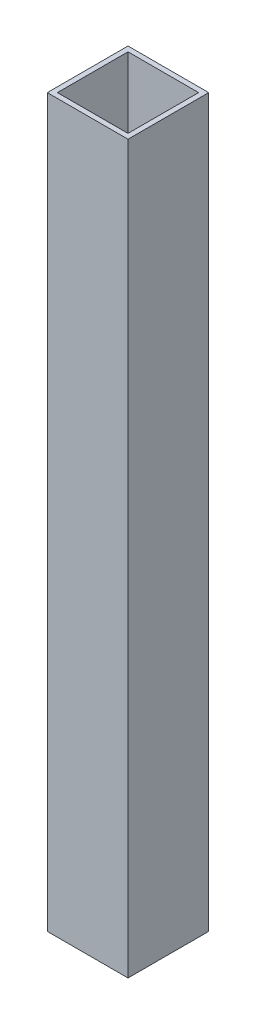
ISO-10303-21;
HEADER;
FILE_DESCRIPTION(('STEP AP214'),'2;1');
FILE_NAME('part.step','',(''),(''),'','','');
FILE_SCHEMA(('AUTOMOTIVE_DESIGN { 1 0 10303 214 1 1 1 1 }'));
ENDSEC;
DATA;
#1=APPLICATION_CONTEXT('core data for automotive mechanical design processes');
#2=APPLICATION_PROTOCOL_DEFINITION('international standard','automotive_design',2000,#1);
#3=PRODUCT_CONTEXT('',#1,'mechanical');
#4=PRODUCT('Part','Part','',(#3));
#5=PRODUCT_RELATED_PRODUCT_CATEGORY('part','',(#4));
#6=PRODUCT_DEFINITION_FORMATION('','',#4);
#7=PRODUCT_DEFINITION_CONTEXT('part definition',#1,'design');
#8=PRODUCT_DEFINITION('design','',#6,#7);
#9=PRODUCT_DEFINITION_SHAPE('','',#8);
#10=(LENGTH_UNIT() NAMED_UNIT(*) SI_UNIT(.MILLI.,.METRE.));
#11=(NAMED_UNIT(*) PLANE_ANGLE_UNIT() SI_UNIT($,.RADIAN.));
#12=(NAMED_UNIT(*) SI_UNIT($,.STERADIAN.) SOLID_ANGLE_UNIT());
#13=UNCERTAINTY_MEASURE_WITH_UNIT(LENGTH_MEASURE(1.E-05),#10,'distance_accuracy_value','');
#14=(GEOMETRIC_REPRESENTATION_CONTEXT(3) GLOBAL_UNCERTAINTY_ASSIGNED_CONTEXT((#13)) GLOBAL_UNIT_ASSIGNED_CONTEXT((#10,
#11,#12)) REPRESENTATION_CONTEXT('',''));
#15=CARTESIAN_POINT('',(0.,0.,0.));
#16=DIRECTION('',(0.,0.,1.));
#17=DIRECTION('',(1.,0.,0.));
#18=AXIS2_PLACEMENT_3D('',#15,#16,#17);
#19=CARTESIAN_POINT('',(0.,228.6,0.));
#20=DIRECTION('',(0.,-1.,0.));
#21=DIRECTION('',(0.,0.,-1.));
#22=AXIS2_PLACEMENT_3D('',#19,#20,#21);
#23=PLANE('',#22);
#24=DIRECTION('',(0.,0.,1.));
#25=VECTOR('',#24,1.);
#26=CARTESIAN_POINT('',(-12.7,228.6,-12.7));
#27=LINE('',#26,#25);
#28=CARTESIAN_POINT('',(-12.7,228.6,-12.7));
#29=VERTEX_POINT('',#28);
#30=CARTESIAN_POINT('',(-12.7,228.6,12.7));
#31=VERTEX_POINT('',#30);
#32=EDGE_CURVE('E134',#29,#31,#27,.T.);
#33=ORIENTED_EDGE('',*,*,#32,.T.);
#34=DIRECTION('',(1.,0.,0.));
#35=VECTOR('',#34,1.);
#36=CARTESIAN_POINT('',(12.7,228.6,12.7));
#37=LINE('',#36,#35);
#38=CARTESIAN_POINT('',(12.7,228.6,12.7));
#39=VERTEX_POINT('',#38);
#40=EDGE_CURVE('E137',#31,#39,#37,.T.);
#41=ORIENTED_EDGE('',*,*,#40,.T.);
#42=DIRECTION('',(0.,0.,-1.));
#43=VECTOR('',#42,1.);
#44=CARTESIAN_POINT('',(12.7,228.6,-12.7));
#45=LINE('',#44,#43);
#46=CARTESIAN_POINT('',(12.7,228.6,-12.7));
#47=VERTEX_POINT('',#46);
#48=EDGE_CURVE('E140',#39,#47,#45,.T.);
#49=ORIENTED_EDGE('',*,*,#48,.T.);
#50=DIRECTION('',(-1.,0.,0.));
#51=VECTOR('',#50,1.);
#52=CARTESIAN_POINT('',(12.7,228.6,-12.7));
#53=LINE('',#52,#51);
#54=EDGE_CURVE('E142',#47,#29,#53,.T.);
#55=ORIENTED_EDGE('',*,*,#54,.T.);
#56=EDGE_LOOP('',(#33,#41,#49,#55));
#57=FACE_BOUND('',#56,.T.);
#58=DIRECTION('',(0.,0.,1.));
#59=VECTOR('',#58,1.);
#60=CARTESIAN_POINT('',(-11.1125,228.6,-11.1125));
#61=LINE('',#60,#59);
#62=CARTESIAN_POINT('',(-11.1125,228.6,-11.1125));
#63=VERTEX_POINT('',#62);
#64=CARTESIAN_POINT('',(-11.1125,228.6,11.1125));
#65=VERTEX_POINT('',#64);
#66=EDGE_CURVE('E98',#63,#65,#61,.T.);
#67=ORIENTED_EDGE('',*,*,#66,.F.);
#68=DIRECTION('',(-1.,0.,0.));
#69=VECTOR('',#68,1.);
#70=CARTESIAN_POINT('',(11.1125,228.6,-11.1125));
#71=LINE('',#70,#69);
#72=CARTESIAN_POINT('',(11.1125,228.6,-11.1125));
#73=VERTEX_POINT('',#72);
#74=EDGE_CURVE('E120',#73,#63,#71,.T.);
#75=ORIENTED_EDGE('',*,*,#74,.F.);
#76=DIRECTION('',(0.,0.,-1.));
#77=VECTOR('',#76,1.);
#78=CARTESIAN_POINT('',(11.1125,228.6,-11.1125));
#79=LINE('',#78,#77);
#80=CARTESIAN_POINT('',(11.1125,228.6,11.1125));
#81=VERTEX_POINT('',#80);
#82=EDGE_CURVE('E118',#81,#73,#79,.T.);
#83=ORIENTED_EDGE('',*,*,#82,.F.);
#84=DIRECTION('',(1.,0.,0.));
#85=VECTOR('',#84,1.);
#86=CARTESIAN_POINT('',(11.1125,228.6,11.1125));
#87=LINE('',#86,#85);
#88=EDGE_CURVE('E106',#65,#81,#87,.T.);
#89=ORIENTED_EDGE('',*,*,#88,.F.);
#90=EDGE_LOOP('',(#67,#75,#83,#89));
#91=FACE_BOUND('',#90,.T.);
#92=ADVANCED_FACE('F33',(#57,#91),#23,.F.);
#93=CARTESIAN_POINT('',(0.,0.,0.));
#94=DIRECTION('',(0.,-1.,0.));
#95=DIRECTION('',(0.,0.,-1.));
#96=AXIS2_PLACEMENT_3D('',#93,#94,#95);
#97=PLANE('',#96);
#98=DIRECTION('',(0.,0.,1.));
#99=VECTOR('',#98,1.);
#100=CARTESIAN_POINT('',(-12.7,0.,-12.7));
#101=LINE('',#100,#99);
#102=CARTESIAN_POINT('',(-12.7,0.,-12.7));
#103=VERTEX_POINT('',#102);
#104=CARTESIAN_POINT('',(-12.7,0.,12.7));
#105=VERTEX_POINT('',#104);
#106=EDGE_CURVE('E114',#103,#105,#101,.T.);
#107=ORIENTED_EDGE('',*,*,#106,.F.);
#108=DIRECTION('',(-1.,0.,0.));
#109=VECTOR('',#108,1.);
#110=CARTESIAN_POINT('',(12.7,0.,-12.7));
#111=LINE('',#110,#109);
#112=CARTESIAN_POINT('',(12.7,0.,-12.7));
#113=VERTEX_POINT('',#112);
#114=EDGE_CURVE('E138',#113,#103,#111,.T.);
#115=ORIENTED_EDGE('',*,*,#114,.F.);
#116=DIRECTION('',(0.,0.,-1.));
#117=VECTOR('',#116,1.);
#118=CARTESIAN_POINT('',(12.7,0.,-12.7));
#119=LINE('',#118,#117);
#120=CARTESIAN_POINT('',(12.7,0.,12.7));
#121=VERTEX_POINT('',#120);
#122=EDGE_CURVE('E149',#121,#113,#119,.T.);
#123=ORIENTED_EDGE('',*,*,#122,.F.);
#124=DIRECTION('',(1.,0.,0.));
#125=VECTOR('',#124,1.);
#126=CARTESIAN_POINT('',(12.7,0.,12.7));
#127=LINE('',#126,#125);
#128=EDGE_CURVE('E147',#105,#121,#127,.T.);
#129=ORIENTED_EDGE('',*,*,#128,.F.);
#130=EDGE_LOOP('',(#107,#115,#123,#129));
#131=FACE_BOUND('',#130,.T.);
#132=DIRECTION('',(-1.,0.,0.));
#133=VECTOR('',#132,1.);
#134=CARTESIAN_POINT('',(11.1125,0.,-11.1125));
#135=LINE('',#134,#133);
#136=CARTESIAN_POINT('',(11.1125,0.,-11.1125));
#137=VERTEX_POINT('',#136);
#138=CARTESIAN_POINT('',(-11.1125,0.,-11.1125));
#139=VERTEX_POINT('',#138);
#140=EDGE_CURVE('E107',#137,#139,#135,.T.);
#141=ORIENTED_EDGE('',*,*,#140,.T.);
#142=DIRECTION('',(0.,0.,1.));
#143=VECTOR('',#142,1.);
#144=CARTESIAN_POINT('',(-11.1125,0.,-11.1125));
#145=LINE('',#144,#143);
#146=CARTESIAN_POINT('',(-11.1125,0.,11.1125));
#147=VERTEX_POINT('',#146);
#148=EDGE_CURVE('E56',#139,#147,#145,.T.);
#149=ORIENTED_EDGE('',*,*,#148,.T.);
#150=DIRECTION('',(1.,0.,0.));
#151=VECTOR('',#150,1.);
#152=CARTESIAN_POINT('',(11.1125,0.,11.1125));
#153=LINE('',#152,#151);
#154=CARTESIAN_POINT('',(11.1125,0.,11.1125));
#155=VERTEX_POINT('',#154);
#156=EDGE_CURVE('E113',#147,#155,#153,.T.);
#157=ORIENTED_EDGE('',*,*,#156,.T.);
#158=DIRECTION('',(0.,0.,-1.));
#159=VECTOR('',#158,1.);
#160=CARTESIAN_POINT('',(11.1125,0.,-11.1125));
#161=LINE('',#160,#159);
#162=EDGE_CURVE('E126',#155,#137,#161,.T.);
#163=ORIENTED_EDGE('',*,*,#162,.T.);
#164=EDGE_LOOP('',(#141,#149,#157,#163));
#165=FACE_BOUND('',#164,.T.);
#166=ADVANCED_FACE('F167',(#131,#165),#97,.T.);
#167=CARTESIAN_POINT('',(-12.7,228.6,-12.7));
#168=DIRECTION('',(1.,0.,0.));
#169=DIRECTION('',(0.,0.,-1.));
#170=AXIS2_PLACEMENT_3D('',#167,#168,#169);
#171=PLANE('',#170);
#172=ORIENTED_EDGE('',*,*,#106,.T.);
#173=DIRECTION('',(0.,-1.,0.));
#174=VECTOR('',#173,1.);
#175=CARTESIAN_POINT('',(-12.7,228.6,12.7));
#176=LINE('',#175,#174);
#177=EDGE_CURVE('E11',#31,#105,#176,.T.);
#178=ORIENTED_EDGE('',*,*,#177,.F.);
#179=ORIENTED_EDGE('',*,*,#32,.F.);
#180=DIRECTION('',(0.,-1.,0.));
#181=VECTOR('',#180,1.);
#182=CARTESIAN_POINT('',(-12.7,228.6,-12.7));
#183=LINE('',#182,#181);
#184=EDGE_CURVE('E144',#29,#103,#183,.T.);
#185=ORIENTED_EDGE('',*,*,#184,.T.);
#186=EDGE_LOOP('',(#172,#178,#179,#185));
#187=FACE_BOUND('',#186,.T.);
#188=ADVANCED_FACE('F35',(#187),#171,.F.);
#189=CARTESIAN_POINT('',(12.7,228.6,12.7));
#190=DIRECTION('',(0.,0.,-1.));
#191=DIRECTION('',(-1.,0.,0.));
#192=AXIS2_PLACEMENT_3D('',#189,#190,#191);
#193=PLANE('',#192);
#194=ORIENTED_EDGE('',*,*,#128,.T.);
#195=DIRECTION('',(0.,-1.,0.));
#196=VECTOR('',#195,1.);
#197=CARTESIAN_POINT('',(12.7,228.6,12.7));
#198=LINE('',#197,#196);
#199=EDGE_CURVE('E41',#39,#121,#198,.T.);
#200=ORIENTED_EDGE('',*,*,#199,.F.);
#201=ORIENTED_EDGE('',*,*,#40,.F.);
#202=ORIENTED_EDGE('',*,*,#177,.T.);
#203=EDGE_LOOP('',(#194,#200,#201,#202));
#204=FACE_BOUND('',#203,.T.);
#205=ADVANCED_FACE('F177',(#204),#193,.F.);
#206=CARTESIAN_POINT('',(12.7,228.6,-12.7));
#207=DIRECTION('',(-1.,0.,0.));
#208=DIRECTION('',(0.,0.,1.));
#209=AXIS2_PLACEMENT_3D('',#206,#207,#208);
#210=PLANE('',#209);
#211=ORIENTED_EDGE('',*,*,#122,.T.);
#212=DIRECTION('',(0.,-1.,0.));
#213=VECTOR('',#212,1.);
#214=CARTESIAN_POINT('',(12.7,228.6,-12.7));
#215=LINE('',#214,#213);
#216=EDGE_CURVE('E154',#47,#113,#215,.T.);
#217=ORIENTED_EDGE('',*,*,#216,.F.);
#218=ORIENTED_EDGE('',*,*,#48,.F.);
#219=ORIENTED_EDGE('',*,*,#199,.T.);
#220=EDGE_LOOP('',(#211,#217,#218,#219));
#221=FACE_BOUND('',#220,.T.);
#222=ADVANCED_FACE('F161',(#221),#210,.F.);
#223=CARTESIAN_POINT('',(12.7,228.6,-12.7));
#224=DIRECTION('',(0.,0.,1.));
#225=DIRECTION('',(1.,0.,0.));
#226=AXIS2_PLACEMENT_3D('',#223,#224,#225);
#227=PLANE('',#226);
#228=ORIENTED_EDGE('',*,*,#114,.T.);
#229=ORIENTED_EDGE('',*,*,#184,.F.);
#230=ORIENTED_EDGE('',*,*,#54,.F.);
#231=ORIENTED_EDGE('',*,*,#216,.T.);
#232=EDGE_LOOP('',(#228,#229,#230,#231));
#233=FACE_BOUND('',#232,.T.);
#234=ADVANCED_FACE('F171',(#233),#227,.F.);
#235=CARTESIAN_POINT('',(-11.1125,228.6,-11.1125));
#236=DIRECTION('',(1.,0.,0.));
#237=DIRECTION('',(0.,0.,-1.));
#238=AXIS2_PLACEMENT_3D('',#235,#236,#237);
#239=PLANE('',#238);
#240=ORIENTED_EDGE('',*,*,#148,.F.);
#241=DIRECTION('',(0.,-1.,0.));
#242=VECTOR('',#241,1.);
#243=CARTESIAN_POINT('',(-11.1125,228.6,-11.1125));
#244=LINE('',#243,#242);
#245=EDGE_CURVE('E102',#63,#139,#244,.T.);
#246=ORIENTED_EDGE('',*,*,#245,.F.);
#247=ORIENTED_EDGE('',*,*,#66,.T.);
#248=DIRECTION('',(0.,-1.,0.));
#249=VECTOR('',#248,1.);
#250=CARTESIAN_POINT('',(-11.1125,228.6,11.1125));
#251=LINE('',#250,#249);
#252=EDGE_CURVE('E101',#65,#147,#251,.T.);
#253=ORIENTED_EDGE('',*,*,#252,.T.);
#254=EDGE_LOOP('',(#240,#246,#247,#253));
#255=FACE_BOUND('',#254,.T.);
#256=ADVANCED_FACE('F100',(#255),#239,.T.);
#257=CARTESIAN_POINT('',(11.1125,228.6,11.1125));
#258=DIRECTION('',(0.,0.,-1.));
#259=DIRECTION('',(-1.,0.,0.));
#260=AXIS2_PLACEMENT_3D('',#257,#258,#259);
#261=PLANE('',#260);
#262=ORIENTED_EDGE('',*,*,#156,.F.);
#263=ORIENTED_EDGE('',*,*,#252,.F.);
#264=ORIENTED_EDGE('',*,*,#88,.T.);
#265=DIRECTION('',(0.,-1.,0.));
#266=VECTOR('',#265,1.);
#267=CARTESIAN_POINT('',(11.1125,228.6,11.1125));
#268=LINE('',#267,#266);
#269=EDGE_CURVE('E115',#81,#155,#268,.T.);
#270=ORIENTED_EDGE('',*,*,#269,.T.);
#271=EDGE_LOOP('',(#262,#263,#264,#270));
#272=FACE_BOUND('',#271,.T.);
#273=ADVANCED_FACE('F110',(#272),#261,.T.);
#274=CARTESIAN_POINT('',(11.1125,228.6,-11.1125));
#275=DIRECTION('',(-1.,0.,0.));
#276=DIRECTION('',(0.,0.,1.));
#277=AXIS2_PLACEMENT_3D('',#274,#275,#276);
#278=PLANE('',#277);
#279=ORIENTED_EDGE('',*,*,#162,.F.);
#280=ORIENTED_EDGE('',*,*,#269,.F.);
#281=ORIENTED_EDGE('',*,*,#82,.T.);
#282=DIRECTION('',(0.,-1.,0.));
#283=VECTOR('',#282,1.);
#284=CARTESIAN_POINT('',(11.1125,228.6,-11.1125));
#285=LINE('',#284,#283);
#286=EDGE_CURVE('E48',#73,#137,#285,.T.);
#287=ORIENTED_EDGE('',*,*,#286,.T.);
#288=EDGE_LOOP('',(#279,#280,#281,#287));
#289=FACE_BOUND('',#288,.T.);
#290=ADVANCED_FACE('F200',(#289),#278,.T.);
#291=CARTESIAN_POINT('',(11.1125,228.6,-11.1125));
#292=DIRECTION('',(0.,0.,1.));
#293=DIRECTION('',(1.,0.,0.));
#294=AXIS2_PLACEMENT_3D('',#291,#292,#293);
#295=PLANE('',#294);
#296=ORIENTED_EDGE('',*,*,#140,.F.);
#297=ORIENTED_EDGE('',*,*,#286,.F.);
#298=ORIENTED_EDGE('',*,*,#74,.T.);
#299=ORIENTED_EDGE('',*,*,#245,.T.);
#300=EDGE_LOOP('',(#296,#297,#298,#299));
#301=FACE_BOUND('',#300,.T.);
#302=ADVANCED_FACE('F204',(#301),#295,.T.);
#303=CLOSED_SHELL('',(#92,#166,#188,#205,#222,#234,#256,#273,#290,#302));
#304=MANIFOLD_SOLID_BREP('B2',#303);
#305=ADVANCED_BREP_SHAPE_REPRESENTATION('',(#18,#304),#14);
#306=SHAPE_DEFINITION_REPRESENTATION(#9,#305);
ENDSEC;
END-ISO-10303-21;
